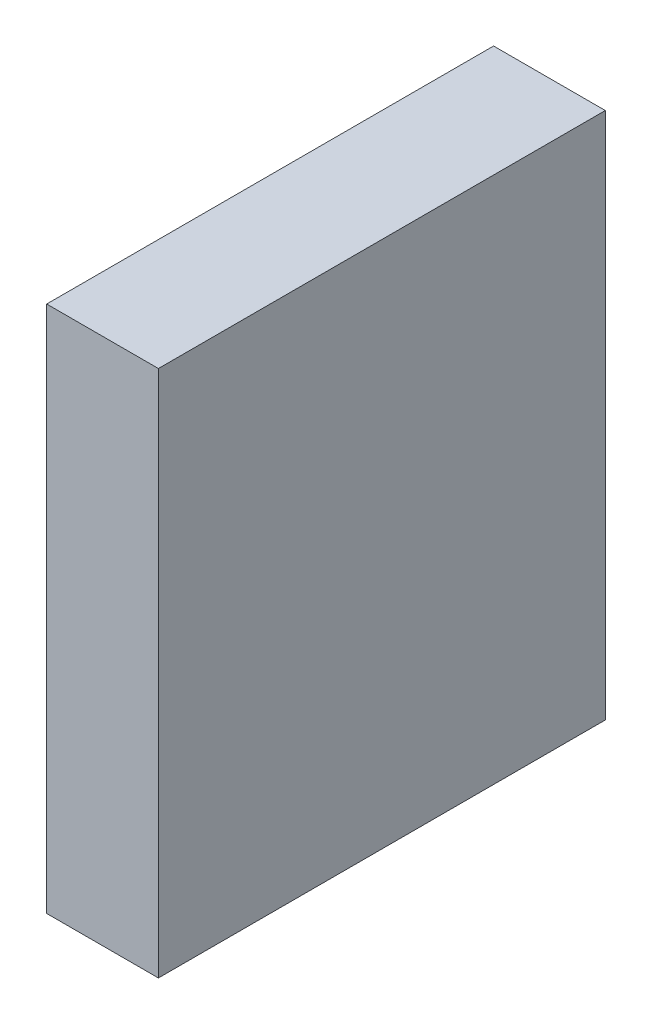
ISO-10303-21;
HEADER;
FILE_DESCRIPTION(('STEP AP214'),'2;1');
FILE_NAME('part.step','',(''),(''),'','','');
FILE_SCHEMA(('AUTOMOTIVE_DESIGN { 1 0 10303 214 1 1 1 1 }'));
ENDSEC;
DATA;
#1=APPLICATION_CONTEXT('core data for automotive mechanical design processes');
#2=APPLICATION_PROTOCOL_DEFINITION('international standard','automotive_design',2000,#1);
#3=PRODUCT_CONTEXT('',#1,'mechanical');
#4=PRODUCT('Part','Part','',(#3));
#5=PRODUCT_RELATED_PRODUCT_CATEGORY('part','',(#4));
#6=PRODUCT_DEFINITION_FORMATION('','',#4);
#7=PRODUCT_DEFINITION_CONTEXT('part definition',#1,'design');
#8=PRODUCT_DEFINITION('design','',#6,#7);
#9=PRODUCT_DEFINITION_SHAPE('','',#8);
#10=(LENGTH_UNIT() NAMED_UNIT(*) SI_UNIT(.MILLI.,.METRE.));
#11=(NAMED_UNIT(*) PLANE_ANGLE_UNIT() SI_UNIT($,.RADIAN.));
#12=(NAMED_UNIT(*) SI_UNIT($,.STERADIAN.) SOLID_ANGLE_UNIT());
#13=UNCERTAINTY_MEASURE_WITH_UNIT(LENGTH_MEASURE(1.E-05),#10,'distance_accuracy_value','');
#14=(GEOMETRIC_REPRESENTATION_CONTEXT(3) GLOBAL_UNCERTAINTY_ASSIGNED_CONTEXT((#13)) GLOBAL_UNIT_ASSIGNED_CONTEXT((#10,
#11,#12)) REPRESENTATION_CONTEXT('',''));
#15=CARTESIAN_POINT('',(0.,0.,0.));
#16=DIRECTION('',(0.,0.,1.));
#17=DIRECTION('',(1.,0.,0.));
#18=AXIS2_PLACEMENT_3D('',#15,#16,#17);
#19=CARTESIAN_POINT('',(-13.4627379558208,12.,12.2684628145786));
#20=DIRECTION('',(1.,0.,0.));
#21=DIRECTION('',(0.,0.,-1.));
#22=AXIS2_PLACEMENT_3D('',#19,#20,#21);
#23=PLANE('',#22);
#24=DIRECTION('',(0.,0.,1.));
#25=VECTOR('',#24,1.);
#26=CARTESIAN_POINT('',(-13.4627379558208,0.,12.2684628145786));
#27=LINE('',#26,#25);
#28=CARTESIAN_POINT('',(-13.4627379558208,0.,2.10846281457865));
#29=VERTEX_POINT('',#28);
#30=CARTESIAN_POINT('',(-13.4627379558208,0.,12.2684628145786));
#31=VERTEX_POINT('',#30);
#32=EDGE_CURVE('E96',#29,#31,#27,.T.);
#33=ORIENTED_EDGE('',*,*,#32,.T.);
#34=DIRECTION('',(0.,-1.,0.));
#35=VECTOR('',#34,1.);
#36=CARTESIAN_POINT('',(-13.4627379558208,12.,12.2684628145786));
#37=LINE('',#36,#35);
#38=CARTESIAN_POINT('',(-13.4627379558208,12.,12.2684628145786));
#39=VERTEX_POINT('',#38);
#40=EDGE_CURVE('E11',#39,#31,#37,.T.);
#41=ORIENTED_EDGE('',*,*,#40,.F.);
#42=DIRECTION('',(0.,0.,1.));
#43=VECTOR('',#42,1.);
#44=CARTESIAN_POINT('',(-13.4627379558208,12.,12.2684628145786));
#45=LINE('',#44,#43);
#46=CARTESIAN_POINT('',(-13.4627379558208,12.,2.10846281457865));
#47=VERTEX_POINT('',#46);
#48=EDGE_CURVE('E84',#47,#39,#45,.T.);
#49=ORIENTED_EDGE('',*,*,#48,.F.);
#50=DIRECTION('',(0.,-1.,0.));
#51=VECTOR('',#50,1.);
#52=CARTESIAN_POINT('',(-13.4627379558208,12.,2.10846281457865));
#53=LINE('',#52,#51);
#54=EDGE_CURVE('E92',#47,#29,#53,.T.);
#55=ORIENTED_EDGE('',*,*,#54,.T.);
#56=EDGE_LOOP('',(#33,#41,#49,#55));
#57=FACE_BOUND('',#56,.T.);
#58=ADVANCED_FACE('F33',(#57),#23,.F.);
#59=CARTESIAN_POINT('',(-13.4627379558208,12.,12.2684628145786));
#60=DIRECTION('',(0.,0.,-1.));
#61=DIRECTION('',(-1.,0.,0.));
#62=AXIS2_PLACEMENT_3D('',#59,#60,#61);
#63=PLANE('',#62);
#64=DIRECTION('',(1.,0.,0.));
#65=VECTOR('',#64,1.);
#66=CARTESIAN_POINT('',(-13.4627379558208,0.,12.2684628145786));
#67=LINE('',#66,#65);
#68=CARTESIAN_POINT('',(-10.9227379558208,0.,12.2684628145786));
#69=VERTEX_POINT('',#68);
#70=EDGE_CURVE('E88',#31,#69,#67,.T.);
#71=ORIENTED_EDGE('',*,*,#70,.T.);
#72=DIRECTION('',(0.,-1.,0.));
#73=VECTOR('',#72,1.);
#74=CARTESIAN_POINT('',(-10.9227379558208,12.,12.2684628145786));
#75=LINE('',#74,#73);
#76=CARTESIAN_POINT('',(-10.9227379558208,12.,12.2684628145786));
#77=VERTEX_POINT('',#76);
#78=EDGE_CURVE('E41',#77,#69,#75,.T.);
#79=ORIENTED_EDGE('',*,*,#78,.F.);
#80=DIRECTION('',(1.,0.,0.));
#81=VECTOR('',#80,1.);
#82=CARTESIAN_POINT('',(-13.4627379558208,12.,12.2684628145786));
#83=LINE('',#82,#81);
#84=EDGE_CURVE('E79',#39,#77,#83,.T.);
#85=ORIENTED_EDGE('',*,*,#84,.F.);
#86=ORIENTED_EDGE('',*,*,#40,.T.);
#87=EDGE_LOOP('',(#71,#79,#85,#86));
#88=FACE_BOUND('',#87,.T.);
#89=ADVANCED_FACE('F87',(#88),#63,.F.);
#90=CARTESIAN_POINT('',(-10.9227379558208,12.,12.2684628145786));
#91=DIRECTION('',(-1.,0.,0.));
#92=DIRECTION('',(0.,0.,1.));
#93=AXIS2_PLACEMENT_3D('',#90,#91,#92);
#94=PLANE('',#93);
#95=DIRECTION('',(0.,0.,-1.));
#96=VECTOR('',#95,1.);
#97=CARTESIAN_POINT('',(-10.9227379558208,0.,12.2684628145786));
#98=LINE('',#97,#96);
#99=CARTESIAN_POINT('',(-10.9227379558208,0.,2.10846281457865));
#100=VERTEX_POINT('',#99);
#101=EDGE_CURVE('E66',#69,#100,#98,.T.);
#102=ORIENTED_EDGE('',*,*,#101,.T.);
#103=DIRECTION('',(0.,-1.,0.));
#104=VECTOR('',#103,1.);
#105=CARTESIAN_POINT('',(-10.9227379558208,12.,2.10846281457865));
#106=LINE('',#105,#104);
#107=CARTESIAN_POINT('',(-10.9227379558208,12.,2.10846281457865));
#108=VERTEX_POINT('',#107);
#109=EDGE_CURVE('E89',#108,#100,#106,.T.);
#110=ORIENTED_EDGE('',*,*,#109,.F.);
#111=DIRECTION('',(0.,0.,-1.));
#112=VECTOR('',#111,1.);
#113=CARTESIAN_POINT('',(-10.9227379558208,12.,12.2684628145786));
#114=LINE('',#113,#112);
#115=EDGE_CURVE('E82',#77,#108,#114,.T.);
#116=ORIENTED_EDGE('',*,*,#115,.F.);
#117=ORIENTED_EDGE('',*,*,#78,.T.);
#118=EDGE_LOOP('',(#102,#110,#116,#117));
#119=FACE_BOUND('',#118,.T.);
#120=ADVANCED_FACE('F90',(#119),#94,.F.);
#121=CARTESIAN_POINT('',(-13.4627379558208,12.,2.10846281457865));
#122=DIRECTION('',(0.,0.,1.));
#123=DIRECTION('',(1.,0.,0.));
#124=AXIS2_PLACEMENT_3D('',#121,#122,#123);
#125=PLANE('',#124);
#126=DIRECTION('',(-1.,0.,0.));
#127=VECTOR('',#126,1.);
#128=CARTESIAN_POINT('',(-13.4627379558208,0.,2.10846281457865));
#129=LINE('',#128,#127);
#130=EDGE_CURVE('E72',#100,#29,#129,.T.);
#131=ORIENTED_EDGE('',*,*,#130,.T.);
#132=ORIENTED_EDGE('',*,*,#54,.F.);
#133=DIRECTION('',(-1.,0.,0.));
#134=VECTOR('',#133,1.);
#135=CARTESIAN_POINT('',(-13.4627379558208,12.,2.10846281457865));
#136=LINE('',#135,#134);
#137=EDGE_CURVE('E49',#108,#47,#136,.T.);
#138=ORIENTED_EDGE('',*,*,#137,.F.);
#139=ORIENTED_EDGE('',*,*,#109,.T.);
#140=EDGE_LOOP('',(#131,#132,#138,#139));
#141=FACE_BOUND('',#140,.T.);
#142=ADVANCED_FACE('F103',(#141),#125,.F.);
#143=CARTESIAN_POINT('',(0.,12.,0.));
#144=DIRECTION('',(0.,-1.,0.));
#145=DIRECTION('',(0.,0.,-1.));
#146=AXIS2_PLACEMENT_3D('',#143,#144,#145);
#147=PLANE('',#146);
#148=ORIENTED_EDGE('',*,*,#48,.T.);
#149=ORIENTED_EDGE('',*,*,#84,.T.);
#150=ORIENTED_EDGE('',*,*,#115,.T.);
#151=ORIENTED_EDGE('',*,*,#137,.T.);
#152=EDGE_LOOP('',(#148,#149,#150,#151));
#153=FACE_BOUND('',#152,.T.);
#154=ADVANCED_FACE('F80',(#153),#147,.F.);
#155=CARTESIAN_POINT('',(0.,0.,0.));
#156=DIRECTION('',(0.,-1.,0.));
#157=DIRECTION('',(0.,0.,-1.));
#158=AXIS2_PLACEMENT_3D('',#155,#156,#157);
#159=PLANE('',#158);
#160=ORIENTED_EDGE('',*,*,#32,.F.);
#161=ORIENTED_EDGE('',*,*,#130,.F.);
#162=ORIENTED_EDGE('',*,*,#101,.F.);
#163=ORIENTED_EDGE('',*,*,#70,.F.);
#164=EDGE_LOOP('',(#160,#161,#162,#163));
#165=FACE_BOUND('',#164,.T.);
#166=ADVANCED_FACE('F106',(#165),#159,.T.);
#167=CLOSED_SHELL('',(#58,#89,#120,#142,#154,#166));
#168=MANIFOLD_SOLID_BREP('B2',#167);
#169=ADVANCED_BREP_SHAPE_REPRESENTATION('',(#18,#168),#14);
#170=SHAPE_DEFINITION_REPRESENTATION(#9,#169);
ENDSEC;
END-ISO-10303-21;
